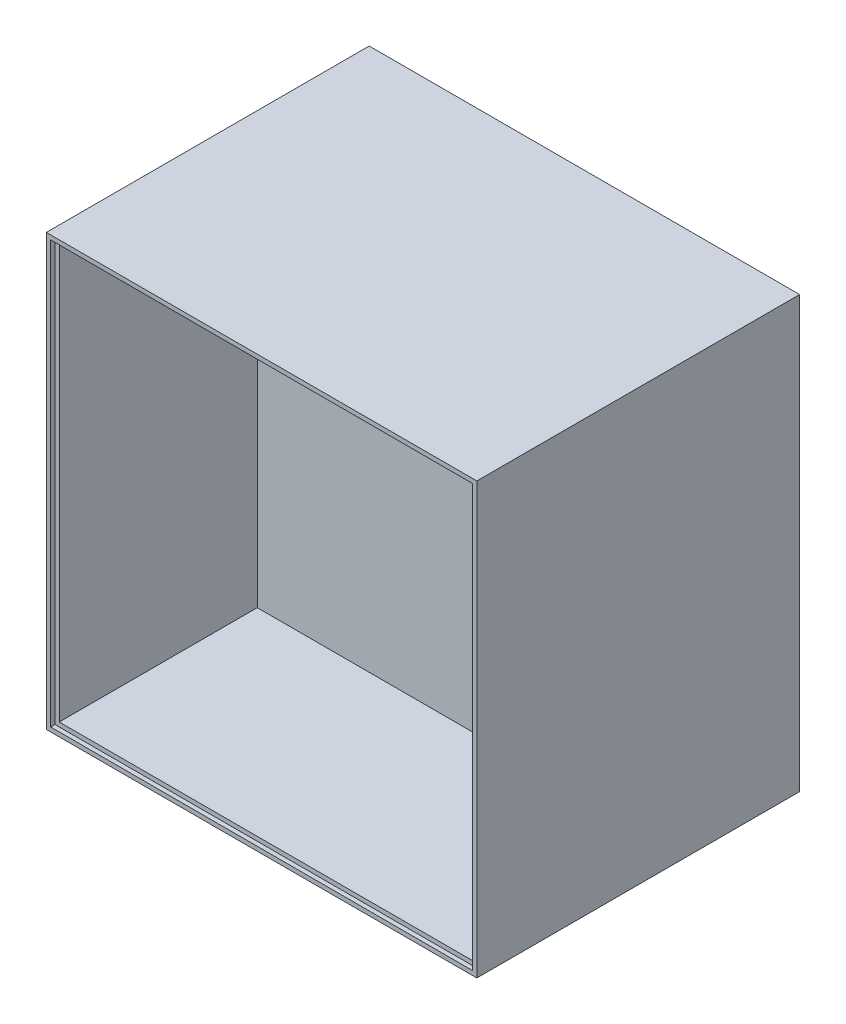
ISO-10303-21;
HEADER;
FILE_DESCRIPTION(('STEP AP214'),'2;1');
FILE_NAME('part.step','',(''),(''),'','','');
FILE_SCHEMA(('AUTOMOTIVE_DESIGN { 1 0 10303 214 1 1 1 1 }'));
ENDSEC;
DATA;
#1=APPLICATION_CONTEXT('core data for automotive mechanical design processes');
#2=APPLICATION_PROTOCOL_DEFINITION('international standard','automotive_design',2000,#1);
#3=PRODUCT_CONTEXT('',#1,'mechanical');
#4=PRODUCT('Part','Part','',(#3));
#5=PRODUCT_RELATED_PRODUCT_CATEGORY('part','',(#4));
#6=PRODUCT_DEFINITION_FORMATION('','',#4);
#7=PRODUCT_DEFINITION_CONTEXT('part definition',#1,'design');
#8=PRODUCT_DEFINITION('design','',#6,#7);
#9=PRODUCT_DEFINITION_SHAPE('','',#8);
#10=(LENGTH_UNIT() NAMED_UNIT(*) SI_UNIT(.MILLI.,.METRE.));
#11=(NAMED_UNIT(*) PLANE_ANGLE_UNIT() SI_UNIT($,.RADIAN.));
#12=(NAMED_UNIT(*) SI_UNIT($,.STERADIAN.) SOLID_ANGLE_UNIT());
#13=UNCERTAINTY_MEASURE_WITH_UNIT(LENGTH_MEASURE(1.E-05),#10,'distance_accuracy_value','');
#14=(GEOMETRIC_REPRESENTATION_CONTEXT(3) GLOBAL_UNCERTAINTY_ASSIGNED_CONTEXT((#13)) GLOBAL_UNIT_ASSIGNED_CONTEXT((#10,
#11,#12)) REPRESENTATION_CONTEXT('',''));
#15=CARTESIAN_POINT('',(0.,0.,0.));
#16=DIRECTION('',(0.,0.,1.));
#17=DIRECTION('',(1.,0.,0.));
#18=AXIS2_PLACEMENT_3D('',#15,#16,#17);
#19=CARTESIAN_POINT('',(0.,0.,150.));
#20=DIRECTION('',(0.,0.,1.));
#21=DIRECTION('',(1.,0.,0.));
#22=AXIS2_PLACEMENT_3D('',#19,#20,#21);
#23=PLANE('',#22);
#24=DIRECTION('',(1.,0.,0.));
#25=VECTOR('',#24,1.);
#26=CARTESIAN_POINT('',(0.,200.,150.));
#27=LINE('',#26,#25);
#28=CARTESIAN_POINT('',(0.,200.,150.));
#29=VERTEX_POINT('',#28);
#30=CARTESIAN_POINT('',(200.,200.,150.));
#31=VERTEX_POINT('',#30);
#32=EDGE_CURVE('E196',#29,#31,#27,.T.);
#33=ORIENTED_EDGE('',*,*,#32,.F.);
#34=DIRECTION('',(0.,1.,0.));
#35=VECTOR('',#34,1.);
#36=CARTESIAN_POINT('',(0.,0.,150.));
#37=LINE('',#36,#35);
#38=CARTESIAN_POINT('',(0.,0.,150.));
#39=VERTEX_POINT('',#38);
#40=EDGE_CURVE('E204',#39,#29,#37,.T.);
#41=ORIENTED_EDGE('',*,*,#40,.F.);
#42=DIRECTION('',(1.,0.,0.));
#43=VECTOR('',#42,1.);
#44=CARTESIAN_POINT('',(0.,0.,150.));
#45=LINE('',#44,#43);
#46=CARTESIAN_POINT('',(200.,0.,150.));
#47=VERTEX_POINT('',#46);
#48=EDGE_CURVE('E202',#39,#47,#45,.T.);
#49=ORIENTED_EDGE('',*,*,#48,.T.);
#50=DIRECTION('',(0.,1.,0.));
#51=VECTOR('',#50,1.);
#52=CARTESIAN_POINT('',(200.,0.,150.));
#53=LINE('',#52,#51);
#54=EDGE_CURVE('E199',#47,#31,#53,.T.);
#55=ORIENTED_EDGE('',*,*,#54,.T.);
#56=EDGE_LOOP('',(#33,#41,#49,#55));
#57=FACE_BOUND('',#56,.T.);
#58=DIRECTION('',(0.,1.,0.));
#59=VECTOR('',#58,1.);
#60=CARTESIAN_POINT('',(1.99999999999995,2.,150.));
#61=LINE('',#60,#59);
#62=CARTESIAN_POINT('',(1.99999999999995,2.,150.));
#63=VERTEX_POINT('',#62);
#64=CARTESIAN_POINT('',(1.99999999999995,198.,150.));
#65=VERTEX_POINT('',#64);
#66=EDGE_CURVE('E170',#63,#65,#61,.T.);
#67=ORIENTED_EDGE('',*,*,#66,.T.);
#68=DIRECTION('',(1.,0.,0.));
#69=VECTOR('',#68,1.);
#70=CARTESIAN_POINT('',(1.99999999999995,198.,150.));
#71=LINE('',#70,#69);
#72=CARTESIAN_POINT('',(198.,198.,150.));
#73=VERTEX_POINT('',#72);
#74=EDGE_CURVE('E61',#65,#73,#71,.T.);
#75=ORIENTED_EDGE('',*,*,#74,.T.);
#76=DIRECTION('',(0.,1.,0.));
#77=VECTOR('',#76,1.);
#78=CARTESIAN_POINT('',(198.,2.,150.));
#79=LINE('',#78,#77);
#80=CARTESIAN_POINT('',(198.,2.,150.));
#81=VERTEX_POINT('',#80);
#82=EDGE_CURVE('E180',#81,#73,#79,.T.);
#83=ORIENTED_EDGE('',*,*,#82,.F.);
#84=DIRECTION('',(1.,0.,0.));
#85=VECTOR('',#84,1.);
#86=CARTESIAN_POINT('',(1.99999999999995,2.,150.));
#87=LINE('',#86,#85);
#88=EDGE_CURVE('E183',#63,#81,#87,.T.);
#89=ORIENTED_EDGE('',*,*,#88,.F.);
#90=EDGE_LOOP('',(#67,#75,#83,#89));
#91=FACE_BOUND('',#90,.T.);
#92=ADVANCED_FACE('F36',(#57,#91),#23,.T.);
#93=CARTESIAN_POINT('',(0.,200.,150.));
#94=DIRECTION('',(0.,1.,0.));
#95=DIRECTION('',(0.,0.,1.));
#96=AXIS2_PLACEMENT_3D('',#93,#94,#95);
#97=PLANE('',#96);
#98=DIRECTION('',(1.,0.,0.));
#99=VECTOR('',#98,1.);
#100=CARTESIAN_POINT('',(0.,200.,0.));
#101=LINE('',#100,#99);
#102=CARTESIAN_POINT('',(0.,200.,0.));
#103=VERTEX_POINT('',#102);
#104=CARTESIAN_POINT('',(200.,200.,0.));
#105=VERTEX_POINT('',#104);
#106=EDGE_CURVE('E195',#103,#105,#101,.T.);
#107=ORIENTED_EDGE('',*,*,#106,.F.);
#108=DIRECTION('',(0.,0.,-1.));
#109=VECTOR('',#108,1.);
#110=CARTESIAN_POINT('',(0.,200.,150.));
#111=LINE('',#110,#109);
#112=EDGE_CURVE('E11',#29,#103,#111,.T.);
#113=ORIENTED_EDGE('',*,*,#112,.F.);
#114=ORIENTED_EDGE('',*,*,#32,.T.);
#115=DIRECTION('',(0.,0.,-1.));
#116=VECTOR('',#115,1.);
#117=CARTESIAN_POINT('',(200.,200.,150.));
#118=LINE('',#117,#116);
#119=EDGE_CURVE('E40',#31,#105,#118,.T.);
#120=ORIENTED_EDGE('',*,*,#119,.T.);
#121=EDGE_LOOP('',(#107,#113,#114,#120));
#122=FACE_BOUND('',#121,.T.);
#123=ADVANCED_FACE('F38',(#122),#97,.T.);
#124=CARTESIAN_POINT('',(0.,0.,150.));
#125=DIRECTION('',(-1.,0.,0.));
#126=DIRECTION('',(0.,0.,1.));
#127=AXIS2_PLACEMENT_3D('',#124,#125,#126);
#128=PLANE('',#127);
#129=DIRECTION('',(0.,1.,0.));
#130=VECTOR('',#129,1.);
#131=CARTESIAN_POINT('',(0.,0.,0.));
#132=LINE('',#131,#130);
#133=CARTESIAN_POINT('',(0.,0.,0.));
#134=VERTEX_POINT('',#133);
#135=EDGE_CURVE('E200',#134,#103,#132,.T.);
#136=ORIENTED_EDGE('',*,*,#135,.F.);
#137=DIRECTION('',(0.,0.,-1.));
#138=VECTOR('',#137,1.);
#139=CARTESIAN_POINT('',(0.,0.,150.));
#140=LINE('',#139,#138);
#141=EDGE_CURVE('E45',#39,#134,#140,.T.);
#142=ORIENTED_EDGE('',*,*,#141,.F.);
#143=ORIENTED_EDGE('',*,*,#40,.T.);
#144=ORIENTED_EDGE('',*,*,#112,.T.);
#145=EDGE_LOOP('',(#136,#142,#143,#144));
#146=FACE_BOUND('',#145,.T.);
#147=ADVANCED_FACE('F232',(#146),#128,.T.);
#148=CARTESIAN_POINT('',(0.,0.,150.));
#149=DIRECTION('',(0.,1.,0.));
#150=DIRECTION('',(0.,0.,1.));
#151=AXIS2_PLACEMENT_3D('',#148,#149,#150);
#152=PLANE('',#151);
#153=DIRECTION('',(1.,0.,0.));
#154=VECTOR('',#153,1.);
#155=CARTESIAN_POINT('',(0.,0.,0.));
#156=LINE('',#155,#154);
#157=CARTESIAN_POINT('',(200.,0.,0.));
#158=VERTEX_POINT('',#157);
#159=EDGE_CURVE('E212',#134,#158,#156,.T.);
#160=ORIENTED_EDGE('',*,*,#159,.T.);
#161=DIRECTION('',(0.,0.,-1.));
#162=VECTOR('',#161,1.);
#163=CARTESIAN_POINT('',(200.,0.,150.));
#164=LINE('',#163,#162);
#165=EDGE_CURVE('E216',#47,#158,#164,.T.);
#166=ORIENTED_EDGE('',*,*,#165,.F.);
#167=ORIENTED_EDGE('',*,*,#48,.F.);
#168=ORIENTED_EDGE('',*,*,#141,.T.);
#169=EDGE_LOOP('',(#160,#166,#167,#168));
#170=FACE_BOUND('',#169,.T.);
#171=ADVANCED_FACE('F238',(#170),#152,.F.);
#172=CARTESIAN_POINT('',(200.,0.,150.));
#173=DIRECTION('',(-1.,0.,0.));
#174=DIRECTION('',(0.,0.,1.));
#175=AXIS2_PLACEMENT_3D('',#172,#173,#174);
#176=PLANE('',#175);
#177=DIRECTION('',(0.,1.,0.));
#178=VECTOR('',#177,1.);
#179=CARTESIAN_POINT('',(200.,0.,0.));
#180=LINE('',#179,#178);
#181=EDGE_CURVE('E209',#158,#105,#180,.T.);
#182=ORIENTED_EDGE('',*,*,#181,.T.);
#183=ORIENTED_EDGE('',*,*,#119,.F.);
#184=ORIENTED_EDGE('',*,*,#54,.F.);
#185=ORIENTED_EDGE('',*,*,#165,.T.);
#186=EDGE_LOOP('',(#182,#183,#184,#185));
#187=FACE_BOUND('',#186,.T.);
#188=ADVANCED_FACE('F226',(#187),#176,.F.);
#189=CARTESIAN_POINT('',(0.,0.,0.));
#190=DIRECTION('',(0.,0.,1.));
#191=DIRECTION('',(1.,0.,0.));
#192=AXIS2_PLACEMENT_3D('',#189,#190,#191);
#193=PLANE('',#192);
#194=ORIENTED_EDGE('',*,*,#106,.T.);
#195=ORIENTED_EDGE('',*,*,#181,.F.);
#196=ORIENTED_EDGE('',*,*,#159,.F.);
#197=ORIENTED_EDGE('',*,*,#135,.T.);
#198=EDGE_LOOP('',(#194,#195,#196,#197));
#199=FACE_BOUND('',#198,.T.);
#200=ADVANCED_FACE('F229',(#199),#193,.F.);
#201=CARTESIAN_POINT('',(1.99999999999995,198.,148.));
#202=DIRECTION('',(0.,-1.,0.));
#203=DIRECTION('',(0.,0.,-1.));
#204=AXIS2_PLACEMENT_3D('',#201,#202,#203);
#205=PLANE('',#204);
#206=ORIENTED_EDGE('',*,*,#74,.F.);
#207=DIRECTION('',(0.,0.,1.));
#208=VECTOR('',#207,1.);
#209=CARTESIAN_POINT('',(1.99999999999995,198.,148.));
#210=LINE('',#209,#208);
#211=CARTESIAN_POINT('',(1.99999999999995,198.,148.));
#212=VERTEX_POINT('',#211);
#213=EDGE_CURVE('E178',#212,#65,#210,.T.);
#214=ORIENTED_EDGE('',*,*,#213,.F.);
#215=DIRECTION('',(1.,0.,0.));
#216=VECTOR('',#215,1.);
#217=CARTESIAN_POINT('',(1.99999999999995,198.,148.));
#218=LINE('',#217,#216);
#219=CARTESIAN_POINT('',(198.,198.,148.));
#220=VERTEX_POINT('',#219);
#221=EDGE_CURVE('E167',#212,#220,#218,.T.);
#222=ORIENTED_EDGE('',*,*,#221,.T.);
#223=DIRECTION('',(0.,0.,1.));
#224=VECTOR('',#223,1.);
#225=CARTESIAN_POINT('',(198.,198.,148.));
#226=LINE('',#225,#224);
#227=EDGE_CURVE('E193',#220,#73,#226,.T.);
#228=ORIENTED_EDGE('',*,*,#227,.T.);
#229=EDGE_LOOP('',(#206,#214,#222,#228));
#230=FACE_BOUND('',#229,.T.);
#231=ADVANCED_FACE('F253',(#230),#205,.T.);
#232=CARTESIAN_POINT('',(198.,2.,148.));
#233=DIRECTION('',(1.,0.,0.));
#234=DIRECTION('',(0.,0.,-1.));
#235=AXIS2_PLACEMENT_3D('',#232,#233,#234);
#236=PLANE('',#235);
#237=ORIENTED_EDGE('',*,*,#82,.T.);
#238=ORIENTED_EDGE('',*,*,#227,.F.);
#239=DIRECTION('',(0.,1.,0.));
#240=VECTOR('',#239,1.);
#241=CARTESIAN_POINT('',(198.,2.,148.));
#242=LINE('',#241,#240);
#243=CARTESIAN_POINT('',(198.,2.,148.));
#244=VERTEX_POINT('',#243);
#245=EDGE_CURVE('E169',#244,#220,#242,.T.);
#246=ORIENTED_EDGE('',*,*,#245,.F.);
#247=DIRECTION('',(0.,0.,1.));
#248=VECTOR('',#247,1.);
#249=CARTESIAN_POINT('',(198.,2.,148.));
#250=LINE('',#249,#248);
#251=EDGE_CURVE('E191',#244,#81,#250,.T.);
#252=ORIENTED_EDGE('',*,*,#251,.T.);
#253=EDGE_LOOP('',(#237,#238,#246,#252));
#254=FACE_BOUND('',#253,.T.);
#255=ADVANCED_FACE('F259',(#254),#236,.F.);
#256=CARTESIAN_POINT('',(1.99999999999995,2.,148.));
#257=DIRECTION('',(0.,-1.,0.));
#258=DIRECTION('',(0.,0.,-1.));
#259=AXIS2_PLACEMENT_3D('',#256,#257,#258);
#260=PLANE('',#259);
#261=ORIENTED_EDGE('',*,*,#88,.T.);
#262=ORIENTED_EDGE('',*,*,#251,.F.);
#263=DIRECTION('',(1.,0.,0.));
#264=VECTOR('',#263,1.);
#265=CARTESIAN_POINT('',(1.99999999999995,2.,148.));
#266=LINE('',#265,#264);
#267=CARTESIAN_POINT('',(1.99999999999995,2.,148.));
#268=VERTEX_POINT('',#267);
#269=EDGE_CURVE('E173',#268,#244,#266,.T.);
#270=ORIENTED_EDGE('',*,*,#269,.F.);
#271=DIRECTION('',(0.,0.,1.));
#272=VECTOR('',#271,1.);
#273=CARTESIAN_POINT('',(1.99999999999995,2.,148.));
#274=LINE('',#273,#272);
#275=EDGE_CURVE('E189',#268,#63,#274,.T.);
#276=ORIENTED_EDGE('',*,*,#275,.T.);
#277=EDGE_LOOP('',(#261,#262,#270,#276));
#278=FACE_BOUND('',#277,.T.);
#279=ADVANCED_FACE('F263',(#278),#260,.F.);
#280=CARTESIAN_POINT('',(1.99999999999995,2.,148.));
#281=DIRECTION('',(1.,0.,0.));
#282=DIRECTION('',(0.,0.,-1.));
#283=AXIS2_PLACEMENT_3D('',#280,#281,#282);
#284=PLANE('',#283);
#285=ORIENTED_EDGE('',*,*,#66,.F.);
#286=ORIENTED_EDGE('',*,*,#275,.F.);
#287=DIRECTION('',(0.,1.,0.));
#288=VECTOR('',#287,1.);
#289=CARTESIAN_POINT('',(1.99999999999995,2.,148.));
#290=LINE('',#289,#288);
#291=EDGE_CURVE('E176',#268,#212,#290,.T.);
#292=ORIENTED_EDGE('',*,*,#291,.T.);
#293=ORIENTED_EDGE('',*,*,#213,.T.);
#294=EDGE_LOOP('',(#285,#286,#292,#293));
#295=FACE_BOUND('',#294,.T.);
#296=ADVANCED_FACE('F268',(#295),#284,.T.);
#297=CARTESIAN_POINT('',(0.,0.,148.));
#298=DIRECTION('',(0.,0.,1.));
#299=DIRECTION('',(1.,0.,0.));
#300=AXIS2_PLACEMENT_3D('',#297,#298,#299);
#301=PLANE('',#300);
#302=DIRECTION('',(0.,1.,0.));
#303=VECTOR('',#302,1.);
#304=CARTESIAN_POINT('',(196.,4.,148.));
#305=LINE('',#304,#303);
#306=CARTESIAN_POINT('',(196.,4.,148.));
#307=VERTEX_POINT('',#306);
#308=CARTESIAN_POINT('',(196.,196.,148.));
#309=VERTEX_POINT('',#308);
#310=EDGE_CURVE('E134',#307,#309,#305,.T.);
#311=ORIENTED_EDGE('',*,*,#310,.F.);
#312=DIRECTION('',(1.,0.,0.));
#313=VECTOR('',#312,1.);
#314=CARTESIAN_POINT('',(4.,4.,148.));
#315=LINE('',#314,#313);
#316=CARTESIAN_POINT('',(4.,4.,148.));
#317=VERTEX_POINT('',#316);
#318=EDGE_CURVE('E151',#317,#307,#315,.T.);
#319=ORIENTED_EDGE('',*,*,#318,.F.);
#320=DIRECTION('',(0.,-1.,0.));
#321=VECTOR('',#320,1.);
#322=CARTESIAN_POINT('',(4.,4.,148.));
#323=LINE('',#322,#321);
#324=CARTESIAN_POINT('',(4.,196.,148.));
#325=VERTEX_POINT('',#324);
#326=EDGE_CURVE('E53',#325,#317,#323,.T.);
#327=ORIENTED_EDGE('',*,*,#326,.F.);
#328=DIRECTION('',(-1.,0.,0.));
#329=VECTOR('',#328,1.);
#330=CARTESIAN_POINT('',(4.,196.,148.));
#331=LINE('',#330,#329);
#332=EDGE_CURVE('E159',#309,#325,#331,.T.);
#333=ORIENTED_EDGE('',*,*,#332,.F.);
#334=EDGE_LOOP('',(#311,#319,#327,#333));
#335=FACE_BOUND('',#334,.T.);
#336=ORIENTED_EDGE('',*,*,#221,.F.);
#337=ORIENTED_EDGE('',*,*,#291,.F.);
#338=ORIENTED_EDGE('',*,*,#269,.T.);
#339=ORIENTED_EDGE('',*,*,#245,.T.);
#340=EDGE_LOOP('',(#336,#337,#338,#339));
#341=FACE_BOUND('',#340,.T.);
#342=ADVANCED_FACE('F274',(#335,#341),#301,.T.);
#343=CARTESIAN_POINT('',(196.,4.,56.));
#344=DIRECTION('',(1.,0.,0.));
#345=DIRECTION('',(0.,0.,-1.));
#346=AXIS2_PLACEMENT_3D('',#343,#344,#345);
#347=PLANE('',#346);
#348=ORIENTED_EDGE('',*,*,#310,.T.);
#349=DIRECTION('',(0.,0.,1.));
#350=VECTOR('',#349,1.);
#351=CARTESIAN_POINT('',(196.,196.,56.));
#352=LINE('',#351,#350);
#353=CARTESIAN_POINT('',(196.,196.,56.));
#354=VERTEX_POINT('',#353);
#355=EDGE_CURVE('E127',#354,#309,#352,.T.);
#356=ORIENTED_EDGE('',*,*,#355,.F.);
#357=DIRECTION('',(0.,1.,0.));
#358=VECTOR('',#357,1.);
#359=CARTESIAN_POINT('',(196.,4.,56.));
#360=LINE('',#359,#358);
#361=CARTESIAN_POINT('',(196.,4.,56.));
#362=VERTEX_POINT('',#361);
#363=EDGE_CURVE('E131',#362,#354,#360,.T.);
#364=ORIENTED_EDGE('',*,*,#363,.F.);
#365=DIRECTION('',(0.,0.,1.));
#366=VECTOR('',#365,1.);
#367=CARTESIAN_POINT('',(196.,4.,56.));
#368=LINE('',#367,#366);
#369=EDGE_CURVE('E162',#362,#307,#368,.T.);
#370=ORIENTED_EDGE('',*,*,#369,.T.);
#371=EDGE_LOOP('',(#348,#356,#364,#370));
#372=FACE_BOUND('',#371,.T.);
#373=ADVANCED_FACE('F129',(#372),#347,.F.);
#374=CARTESIAN_POINT('',(4.,4.,56.));
#375=DIRECTION('',(0.,-1.,0.));
#376=DIRECTION('',(0.,0.,-1.));
#377=AXIS2_PLACEMENT_3D('',#374,#375,#376);
#378=PLANE('',#377);
#379=ORIENTED_EDGE('',*,*,#318,.T.);
#380=ORIENTED_EDGE('',*,*,#369,.F.);
#381=DIRECTION('',(1.,0.,0.));
#382=VECTOR('',#381,1.);
#383=CARTESIAN_POINT('',(4.,4.,56.));
#384=LINE('',#383,#382);
#385=CARTESIAN_POINT('',(4.,4.,56.));
#386=VERTEX_POINT('',#385);
#387=EDGE_CURVE('E139',#386,#362,#384,.T.);
#388=ORIENTED_EDGE('',*,*,#387,.F.);
#389=DIRECTION('',(0.,0.,1.));
#390=VECTOR('',#389,1.);
#391=CARTESIAN_POINT('',(4.,4.,56.));
#392=LINE('',#391,#390);
#393=EDGE_CURVE('E164',#386,#317,#392,.T.);
#394=ORIENTED_EDGE('',*,*,#393,.T.);
#395=EDGE_LOOP('',(#379,#380,#388,#394));
#396=FACE_BOUND('',#395,.T.);
#397=ADVANCED_FACE('F281',(#396),#378,.F.);
#398=CARTESIAN_POINT('',(4.,4.,56.));
#399=DIRECTION('',(-1.,0.,0.));
#400=DIRECTION('',(0.,0.,1.));
#401=AXIS2_PLACEMENT_3D('',#398,#399,#400);
#402=PLANE('',#401);
#403=ORIENTED_EDGE('',*,*,#326,.T.);
#404=ORIENTED_EDGE('',*,*,#393,.F.);
#405=DIRECTION('',(0.,-1.,0.));
#406=VECTOR('',#405,1.);
#407=CARTESIAN_POINT('',(4.,4.,56.));
#408=LINE('',#407,#406);
#409=CARTESIAN_POINT('',(4.,196.,56.));
#410=VERTEX_POINT('',#409);
#411=EDGE_CURVE('E147',#410,#386,#408,.T.);
#412=ORIENTED_EDGE('',*,*,#411,.F.);
#413=DIRECTION('',(0.,0.,1.));
#414=VECTOR('',#413,1.);
#415=CARTESIAN_POINT('',(4.,196.,56.));
#416=LINE('',#415,#414);
#417=EDGE_CURVE('E138',#410,#325,#416,.T.);
#418=ORIENTED_EDGE('',*,*,#417,.T.);
#419=EDGE_LOOP('',(#403,#404,#412,#418));
#420=FACE_BOUND('',#419,.T.);
#421=ADVANCED_FACE('F284',(#420),#402,.F.);
#422=CARTESIAN_POINT('',(4.,196.,56.));
#423=DIRECTION('',(0.,1.,0.));
#424=DIRECTION('',(0.,0.,1.));
#425=AXIS2_PLACEMENT_3D('',#422,#423,#424);
#426=PLANE('',#425);
#427=ORIENTED_EDGE('',*,*,#332,.T.);
#428=ORIENTED_EDGE('',*,*,#417,.F.);
#429=DIRECTION('',(-1.,0.,0.));
#430=VECTOR('',#429,1.);
#431=CARTESIAN_POINT('',(4.,196.,56.));
#432=LINE('',#431,#430);
#433=EDGE_CURVE('E142',#354,#410,#432,.T.);
#434=ORIENTED_EDGE('',*,*,#433,.F.);
#435=ORIENTED_EDGE('',*,*,#355,.T.);
#436=EDGE_LOOP('',(#427,#428,#434,#435));
#437=FACE_BOUND('',#436,.T.);
#438=ADVANCED_FACE('F143',(#437),#426,.F.);
#439=CARTESIAN_POINT('',(0.,0.,56.));
#440=DIRECTION('',(0.,0.,-1.));
#441=DIRECTION('',(-1.,0.,0.));
#442=AXIS2_PLACEMENT_3D('',#439,#440,#441);
#443=PLANE('',#442);
#444=ORIENTED_EDGE('',*,*,#363,.T.);
#445=ORIENTED_EDGE('',*,*,#433,.T.);
#446=ORIENTED_EDGE('',*,*,#411,.T.);
#447=ORIENTED_EDGE('',*,*,#387,.T.);
#448=EDGE_LOOP('',(#444,#445,#446,#447));
#449=FACE_BOUND('',#448,.T.);
#450=ADVANCED_FACE('F149',(#449),#443,.F.);
#451=CLOSED_SHELL('',(#92,#123,#147,#171,#188,#200,#231,#255,#279,#296,#342,#373,#397,#421,#438,#450));
#452=MANIFOLD_SOLID_BREP('B2',#451);
#453=ADVANCED_BREP_SHAPE_REPRESENTATION('',(#18,#452),#14);
#454=SHAPE_DEFINITION_REPRESENTATION(#9,#453);
ENDSEC;
END-ISO-10303-21;
